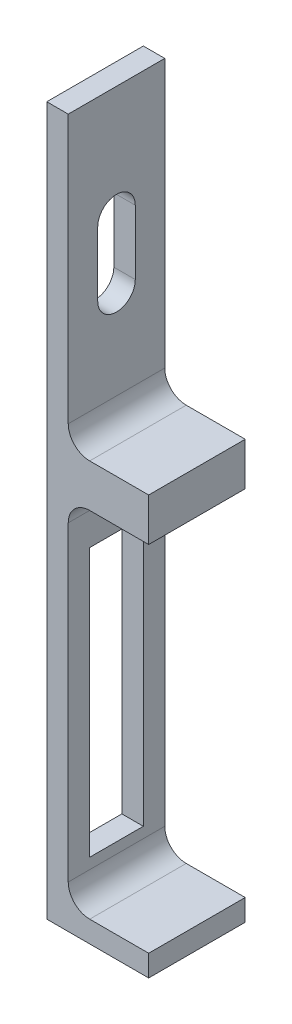
ISO-10303-21;
HEADER;
FILE_DESCRIPTION(('STEP AP214'),'2;1');
FILE_NAME('part.step','',(''),(''),'','','');
FILE_SCHEMA(('AUTOMOTIVE_DESIGN { 1 0 10303 214 1 1 1 1 }'));
ENDSEC;
DATA;
#1=APPLICATION_CONTEXT('core data for automotive mechanical design processes');
#2=APPLICATION_PROTOCOL_DEFINITION('international standard','automotive_design',2000,#1);
#3=PRODUCT_CONTEXT('',#1,'mechanical');
#4=PRODUCT('Part','Part','',(#3));
#5=PRODUCT_RELATED_PRODUCT_CATEGORY('part','',(#4));
#6=PRODUCT_DEFINITION_FORMATION('','',#4);
#7=PRODUCT_DEFINITION_CONTEXT('part definition',#1,'design');
#8=PRODUCT_DEFINITION('design','',#6,#7);
#9=PRODUCT_DEFINITION_SHAPE('','',#8);
#10=(LENGTH_UNIT() NAMED_UNIT(*) SI_UNIT(.MILLI.,.METRE.));
#11=(NAMED_UNIT(*) PLANE_ANGLE_UNIT() SI_UNIT($,.RADIAN.));
#12=(NAMED_UNIT(*) SI_UNIT($,.STERADIAN.) SOLID_ANGLE_UNIT());
#13=UNCERTAINTY_MEASURE_WITH_UNIT(LENGTH_MEASURE(1.E-05),#10,'distance_accuracy_value','');
#14=(GEOMETRIC_REPRESENTATION_CONTEXT(3) GLOBAL_UNCERTAINTY_ASSIGNED_CONTEXT((#13)) GLOBAL_UNIT_ASSIGNED_CONTEXT((#10,
#11,#12)) REPRESENTATION_CONTEXT('',''));
#15=CARTESIAN_POINT('',(0.,0.,0.));
#16=DIRECTION('',(0.,0.,1.));
#17=DIRECTION('',(1.,0.,0.));
#18=AXIS2_PLACEMENT_3D('',#15,#16,#17);
#19=CARTESIAN_POINT('',(2.,2.,9.));
#20=DIRECTION('',(-1.,0.,0.));
#21=DIRECTION('',(0.,0.,1.));
#22=AXIS2_PLACEMENT_3D('',#19,#20,#21);
#23=PLANE('',#22);
#24=DIRECTION('',(0.,1.,0.));
#25=VECTOR('',#24,1.);
#26=CARTESIAN_POINT('',(2.,2.,6.25000000000002));
#27=LINE('',#26,#25);
#28=CARTESIAN_POINT('',(2.,49.52,6.25000000000001));
#29=VERTEX_POINT('',#28);
#30=CARTESIAN_POINT('',(2.,55.52,6.25000000000001));
#31=VERTEX_POINT('',#30);
#32=EDGE_CURVE('E304',#29,#31,#27,.T.);
#33=ORIENTED_EDGE('',*,*,#32,.T.);
#34=CARTESIAN_POINT('',(2.,55.52,4.5));
#35=DIRECTION('',(-1.,0.,0.));
#36=DIRECTION('',(0.,0.,1.));
#37=AXIS2_PLACEMENT_3D('',#34,#35,#36);
#38=CIRCLE('',#37,1.75);
#39=CARTESIAN_POINT('',(2.,55.52,2.75));
#40=VERTEX_POINT('',#39);
#41=EDGE_CURVE('E307',#31,#40,#38,.T.);
#42=ORIENTED_EDGE('',*,*,#41,.T.);
#43=DIRECTION('',(0.,-1.,0.));
#44=VECTOR('',#43,1.);
#45=CARTESIAN_POINT('',(2.,2.,2.75000000000002));
#46=LINE('',#45,#44);
#47=CARTESIAN_POINT('',(2.,49.52,2.75));
#48=VERTEX_POINT('',#47);
#49=EDGE_CURVE('E298',#40,#48,#46,.T.);
#50=ORIENTED_EDGE('',*,*,#49,.T.);
#51=CARTESIAN_POINT('',(2.,49.52,4.50000000000001));
#52=DIRECTION('',(-1.,0.,0.));
#53=DIRECTION('',(0.,0.,1.));
#54=AXIS2_PLACEMENT_3D('',#51,#52,#53);
#55=CIRCLE('',#54,1.75);
#56=EDGE_CURVE('E301',#48,#29,#55,.T.);
#57=ORIENTED_EDGE('',*,*,#56,.T.);
#58=EDGE_LOOP('',(#33,#42,#50,#57));
#59=FACE_BOUND('',#58,.T.);
#60=DIRECTION('',(0.,1.,0.));
#61=VECTOR('',#60,1.);
#62=CARTESIAN_POINT('',(2.,2.,9.));
#63=LINE('',#62,#61);
#64=CARTESIAN_POINT('',(2.,41.,9.));
#65=VERTEX_POINT('',#64);
#66=CARTESIAN_POINT('',(2.,66.,9.));
#67=VERTEX_POINT('',#66);
#68=EDGE_CURVE('E264',#65,#67,#63,.T.);
#69=ORIENTED_EDGE('',*,*,#68,.F.);
#70=DIRECTION('',(0.,0.,1.));
#71=VECTOR('',#70,1.);
#72=CARTESIAN_POINT('',(2.,41.,9.));
#73=LINE('',#72,#71);
#74=CARTESIAN_POINT('',(2.,41.,0.));
#75=VERTEX_POINT('',#74);
#76=EDGE_CURVE('E322',#65,#75,#73,.F.);
#77=ORIENTED_EDGE('',*,*,#76,.T.);
#78=DIRECTION('',(0.,1.,0.));
#79=VECTOR('',#78,1.);
#80=CARTESIAN_POINT('',(2.,2.,0.));
#81=LINE('',#80,#79);
#82=CARTESIAN_POINT('',(2.,66.,0.));
#83=VERTEX_POINT('',#82);
#84=EDGE_CURVE('E279',#75,#83,#81,.T.);
#85=ORIENTED_EDGE('',*,*,#84,.T.);
#86=DIRECTION('',(0.,0.,-1.));
#87=VECTOR('',#86,1.);
#88=CARTESIAN_POINT('',(2.,66.,9.));
#89=LINE('',#88,#87);
#90=EDGE_CURVE('E286',#67,#83,#89,.T.);
#91=ORIENTED_EDGE('',*,*,#90,.F.);
#92=EDGE_LOOP('',(#69,#77,#85,#91));
#93=FACE_BOUND('',#92,.T.);
#94=ADVANCED_FACE('F36',(#59,#93),#23,.F.);
#95=CARTESIAN_POINT('',(0.,66.,9.));
#96=DIRECTION('',(1.,0.,0.));
#97=DIRECTION('',(0.,1.,0.));
#98=AXIS2_PLACEMENT_3D('',#95,#96,#97);
#99=PLANE('',#98);
#100=DIRECTION('',(0.,0.,1.));
#101=VECTOR('',#100,1.);
#102=CARTESIAN_POINT('',(0.,30.,7.));
#103=LINE('',#102,#101);
#104=CARTESIAN_POINT('',(0.,30.,2.00000000000001));
#105=VERTEX_POINT('',#104);
#106=CARTESIAN_POINT('',(0.,30.,7.));
#107=VERTEX_POINT('',#106);
#108=EDGE_CURVE('E210',#105,#107,#103,.T.);
#109=ORIENTED_EDGE('',*,*,#108,.T.);
#110=DIRECTION('',(0.,-1.,0.));
#111=VECTOR('',#110,1.);
#112=CARTESIAN_POINT('',(0.,5.,7.));
#113=LINE('',#112,#111);
#114=CARTESIAN_POINT('',(0.,5.,7.));
#115=VERTEX_POINT('',#114);
#116=EDGE_CURVE('E200',#107,#115,#113,.T.);
#117=ORIENTED_EDGE('',*,*,#116,.T.);
#118=DIRECTION('',(0.,0.,-1.));
#119=VECTOR('',#118,1.);
#120=CARTESIAN_POINT('',(0.,5.,7.));
#121=LINE('',#120,#119);
#122=CARTESIAN_POINT('',(0.,5.,2.00000000000001));
#123=VERTEX_POINT('',#122);
#124=EDGE_CURVE('E203',#115,#123,#121,.T.);
#125=ORIENTED_EDGE('',*,*,#124,.T.);
#126=DIRECTION('',(0.,1.,0.));
#127=VECTOR('',#126,1.);
#128=CARTESIAN_POINT('',(0.,5.,2.00000000000001));
#129=LINE('',#128,#127);
#130=EDGE_CURVE('E207',#123,#105,#129,.T.);
#131=ORIENTED_EDGE('',*,*,#130,.T.);
#132=EDGE_LOOP('',(#109,#117,#125,#131));
#133=FACE_BOUND('',#132,.T.);
#134=DIRECTION('',(0.,-1.,0.));
#135=VECTOR('',#134,1.);
#136=CARTESIAN_POINT('',(0.,55.52,2.75));
#137=LINE('',#136,#135);
#138=CARTESIAN_POINT('',(0.,55.52,2.75));
#139=VERTEX_POINT('',#138);
#140=CARTESIAN_POINT('',(0.,49.52,2.75));
#141=VERTEX_POINT('',#140);
#142=EDGE_CURVE('E235',#139,#141,#137,.T.);
#143=ORIENTED_EDGE('',*,*,#142,.F.);
#144=CARTESIAN_POINT('',(0.,55.52,4.5));
#145=DIRECTION('',(-1.,0.,0.));
#146=DIRECTION('',(0.,-1.,0.));
#147=AXIS2_PLACEMENT_3D('',#144,#145,#146);
#148=CIRCLE('',#147,1.75);
#149=CARTESIAN_POINT('',(0.,55.52,6.25000000000001));
#150=VERTEX_POINT('',#149);
#151=EDGE_CURVE('E227',#150,#139,#148,.T.);
#152=ORIENTED_EDGE('',*,*,#151,.F.);
#153=DIRECTION('',(0.,1.,0.));
#154=VECTOR('',#153,1.);
#155=CARTESIAN_POINT('',(0.,55.52,6.25000000000001));
#156=LINE('',#155,#154);
#157=CARTESIAN_POINT('',(0.,49.52,6.25000000000001));
#158=VERTEX_POINT('',#157);
#159=EDGE_CURVE('E241',#158,#150,#156,.T.);
#160=ORIENTED_EDGE('',*,*,#159,.F.);
#161=CARTESIAN_POINT('',(0.,49.52,4.50000000000001));
#162=DIRECTION('',(-1.,0.,0.));
#163=DIRECTION('',(0.,-1.,0.));
#164=AXIS2_PLACEMENT_3D('',#161,#162,#163);
#165=CIRCLE('',#164,1.75);
#166=EDGE_CURVE('E238',#141,#158,#165,.T.);
#167=ORIENTED_EDGE('',*,*,#166,.F.);
#168=EDGE_LOOP('',(#143,#152,#160,#167));
#169=FACE_BOUND('',#168,.T.);
#170=DIRECTION('',(0.,-1.,0.));
#171=VECTOR('',#170,1.);
#172=CARTESIAN_POINT('',(0.,66.,0.));
#173=LINE('',#172,#171);
#174=CARTESIAN_POINT('',(0.,66.,0.));
#175=VERTEX_POINT('',#174);
#176=CARTESIAN_POINT('',(0.,0.,0.));
#177=VERTEX_POINT('',#176);
#178=EDGE_CURVE('E247',#175,#177,#173,.T.);
#179=ORIENTED_EDGE('',*,*,#178,.T.);
#180=DIRECTION('',(0.,0.,-1.));
#181=VECTOR('',#180,1.);
#182=CARTESIAN_POINT('',(0.,0.,9.));
#183=LINE('',#182,#181);
#184=CARTESIAN_POINT('',(0.,0.,9.));
#185=VERTEX_POINT('',#184);
#186=EDGE_CURVE('E295',#185,#177,#183,.T.);
#187=ORIENTED_EDGE('',*,*,#186,.F.);
#188=DIRECTION('',(0.,-1.,0.));
#189=VECTOR('',#188,1.);
#190=CARTESIAN_POINT('',(0.,66.,9.));
#191=LINE('',#190,#189);
#192=CARTESIAN_POINT('',(0.,66.,9.));
#193=VERTEX_POINT('',#192);
#194=EDGE_CURVE('E254',#193,#185,#191,.T.);
#195=ORIENTED_EDGE('',*,*,#194,.F.);
#196=DIRECTION('',(0.,0.,-1.));
#197=VECTOR('',#196,1.);
#198=CARTESIAN_POINT('',(0.,66.,9.));
#199=LINE('',#198,#197);
#200=EDGE_CURVE('E269',#193,#175,#199,.T.);
#201=ORIENTED_EDGE('',*,*,#200,.T.);
#202=EDGE_LOOP('',(#179,#187,#195,#201));
#203=FACE_BOUND('',#202,.T.);
#204=ADVANCED_FACE('F357',(#133,#169,#203),#99,.F.);
#205=CARTESIAN_POINT('',(0.,0.,9.));
#206=DIRECTION('',(0.,1.,0.));
#207=DIRECTION('',(0.,0.,1.));
#208=AXIS2_PLACEMENT_3D('',#205,#206,#207);
#209=PLANE('',#208);
#210=DIRECTION('',(1.,0.,0.));
#211=VECTOR('',#210,1.);
#212=CARTESIAN_POINT('',(0.,0.,0.));
#213=LINE('',#212,#211);
#214=CARTESIAN_POINT('',(9.5,0.,0.));
#215=VERTEX_POINT('',#214);
#216=EDGE_CURVE('E272',#177,#215,#213,.T.);
#217=ORIENTED_EDGE('',*,*,#216,.T.);
#218=DIRECTION('',(0.,0.,-1.));
#219=VECTOR('',#218,1.);
#220=CARTESIAN_POINT('',(9.5,0.,9.));
#221=LINE('',#220,#219);
#222=CARTESIAN_POINT('',(9.5,0.,9.));
#223=VERTEX_POINT('',#222);
#224=EDGE_CURVE('E292',#223,#215,#221,.T.);
#225=ORIENTED_EDGE('',*,*,#224,.F.);
#226=DIRECTION('',(1.,0.,0.));
#227=VECTOR('',#226,1.);
#228=CARTESIAN_POINT('',(0.,0.,9.));
#229=LINE('',#228,#227);
#230=EDGE_CURVE('E256',#185,#223,#229,.T.);
#231=ORIENTED_EDGE('',*,*,#230,.F.);
#232=ORIENTED_EDGE('',*,*,#186,.T.);
#233=EDGE_LOOP('',(#217,#225,#231,#232));
#234=FACE_BOUND('',#233,.T.);
#235=ADVANCED_FACE('F359',(#234),#209,.F.);
#236=CARTESIAN_POINT('',(9.5,0.,9.));
#237=DIRECTION('',(-1.,0.,0.));
#238=DIRECTION('',(0.,0.,1.));
#239=AXIS2_PLACEMENT_3D('',#236,#237,#238);
#240=PLANE('',#239);
#241=DIRECTION('',(0.,1.,0.));
#242=VECTOR('',#241,1.);
#243=CARTESIAN_POINT('',(9.5,0.,0.));
#244=LINE('',#243,#242);
#245=CARTESIAN_POINT('',(9.5,2.,0.));
#246=VERTEX_POINT('',#245);
#247=EDGE_CURVE('E274',#215,#246,#244,.T.);
#248=ORIENTED_EDGE('',*,*,#247,.T.);
#249=DIRECTION('',(0.,0.,-1.));
#250=VECTOR('',#249,1.);
#251=CARTESIAN_POINT('',(9.5,2.,9.));
#252=LINE('',#251,#250);
#253=CARTESIAN_POINT('',(9.5,2.,9.));
#254=VERTEX_POINT('',#253);
#255=EDGE_CURVE('E289',#254,#246,#252,.T.);
#256=ORIENTED_EDGE('',*,*,#255,.F.);
#257=DIRECTION('',(0.,1.,0.));
#258=VECTOR('',#257,1.);
#259=CARTESIAN_POINT('',(9.5,0.,9.));
#260=LINE('',#259,#258);
#261=EDGE_CURVE('E259',#223,#254,#260,.T.);
#262=ORIENTED_EDGE('',*,*,#261,.F.);
#263=ORIENTED_EDGE('',*,*,#224,.T.);
#264=EDGE_LOOP('',(#248,#256,#262,#263));
#265=FACE_BOUND('',#264,.T.);
#266=ADVANCED_FACE('F364',(#265),#240,.F.);
#267=CARTESIAN_POINT('',(9.5,2.,9.));
#268=DIRECTION('',(0.,-1.,0.));
#269=DIRECTION('',(1.,0.,0.));
#270=AXIS2_PLACEMENT_3D('',#267,#268,#269);
#271=PLANE('',#270);
#272=DIRECTION('',(-1.,0.,0.));
#273=VECTOR('',#272,1.);
#274=CARTESIAN_POINT('',(9.5,2.,0.));
#275=LINE('',#274,#273);
#276=CARTESIAN_POINT('',(4.,2.,0.));
#277=VERTEX_POINT('',#276);
#278=EDGE_CURVE('E276',#246,#277,#275,.T.);
#279=ORIENTED_EDGE('',*,*,#278,.T.);
#280=DIRECTION('',(0.,0.,-1.));
#281=VECTOR('',#280,1.);
#282=CARTESIAN_POINT('',(4.,2.,9.));
#283=LINE('',#282,#281);
#284=CARTESIAN_POINT('',(4.,2.,9.));
#285=VERTEX_POINT('',#284);
#286=EDGE_CURVE('E313',#277,#285,#283,.F.);
#287=ORIENTED_EDGE('',*,*,#286,.T.);
#288=DIRECTION('',(-1.,0.,0.));
#289=VECTOR('',#288,1.);
#290=CARTESIAN_POINT('',(9.5,2.,9.));
#291=LINE('',#290,#289);
#292=EDGE_CURVE('E261',#254,#285,#291,.T.);
#293=ORIENTED_EDGE('',*,*,#292,.F.);
#294=ORIENTED_EDGE('',*,*,#255,.T.);
#295=EDGE_LOOP('',(#279,#287,#293,#294));
#296=FACE_BOUND('',#295,.T.);
#297=ADVANCED_FACE('F395',(#296),#271,.F.);
#298=DIRECTION('',(0.,0.,-1.));
#299=VECTOR('',#298,1.);
#300=CARTESIAN_POINT('',(2.,5.,7.));
#301=LINE('',#300,#299);
#302=CARTESIAN_POINT('',(2.,5.,7.));
#303=VERTEX_POINT('',#302);
#304=CARTESIAN_POINT('',(2.,5.,2.00000000000001));
#305=VERTEX_POINT('',#304);
#306=EDGE_CURVE('E216',#303,#305,#301,.T.);
#307=ORIENTED_EDGE('',*,*,#306,.F.);
#308=DIRECTION('',(0.,-1.,0.));
#309=VECTOR('',#308,1.);
#310=CARTESIAN_POINT('',(2.,5.,7.));
#311=LINE('',#310,#309);
#312=CARTESIAN_POINT('',(2.,30.,7.));
#313=VERTEX_POINT('',#312);
#314=EDGE_CURVE('E214',#313,#303,#311,.T.);
#315=ORIENTED_EDGE('',*,*,#314,.F.);
#316=DIRECTION('',(0.,0.,1.));
#317=VECTOR('',#316,1.);
#318=CARTESIAN_POINT('',(2.,30.,7.));
#319=LINE('',#318,#317);
#320=CARTESIAN_POINT('',(2.,30.,2.00000000000001));
#321=VERTEX_POINT('',#320);
#322=EDGE_CURVE('E204',#321,#313,#319,.T.);
#323=ORIENTED_EDGE('',*,*,#322,.F.);
#324=DIRECTION('',(0.,1.,0.));
#325=VECTOR('',#324,1.);
#326=CARTESIAN_POINT('',(2.,5.,2.00000000000001));
#327=LINE('',#326,#325);
#328=EDGE_CURVE('E220',#305,#321,#327,.T.);
#329=ORIENTED_EDGE('',*,*,#328,.F.);
#330=EDGE_LOOP('',(#307,#315,#323,#329));
#331=FACE_BOUND('',#330,.T.);
#332=CARTESIAN_POINT('',(2.,4.,0.));
#333=VERTEX_POINT('',#332);
#334=CARTESIAN_POINT('',(2.,33.,0.));
#335=VERTEX_POINT('',#334);
#336=EDGE_CURVE('E280',#333,#335,#81,.T.);
#337=ORIENTED_EDGE('',*,*,#336,.T.);
#338=DIRECTION('',(0.,0.,1.));
#339=VECTOR('',#338,1.);
#340=CARTESIAN_POINT('',(2.,33.,9.));
#341=LINE('',#340,#339);
#342=CARTESIAN_POINT('',(2.,33.,9.));
#343=VERTEX_POINT('',#342);
#344=EDGE_CURVE('E324',#335,#343,#341,.T.);
#345=ORIENTED_EDGE('',*,*,#344,.T.);
#346=CARTESIAN_POINT('',(2.,4.,9.));
#347=VERTEX_POINT('',#346);
#348=EDGE_CURVE('E265',#347,#343,#63,.T.);
#349=ORIENTED_EDGE('',*,*,#348,.F.);
#350=DIRECTION('',(0.,0.,-1.));
#351=VECTOR('',#350,1.);
#352=CARTESIAN_POINT('',(2.,4.,0.));
#353=LINE('',#352,#351);
#354=EDGE_CURVE('E310',#347,#333,#353,.T.);
#355=ORIENTED_EDGE('',*,*,#354,.T.);
#356=EDGE_LOOP('',(#337,#345,#349,#355));
#357=FACE_BOUND('',#356,.T.);
#358=ADVANCED_FACE('F375',(#331,#357),#23,.F.);
#359=CARTESIAN_POINT('',(2.,66.,9.));
#360=DIRECTION('',(0.,-1.,0.));
#361=DIRECTION('',(0.,0.,-1.));
#362=AXIS2_PLACEMENT_3D('',#359,#360,#361);
#363=PLANE('',#362);
#364=DIRECTION('',(-1.,0.,0.));
#365=VECTOR('',#364,1.);
#366=CARTESIAN_POINT('',(2.,66.,0.));
#367=LINE('',#366,#365);
#368=EDGE_CURVE('E257',#83,#175,#367,.T.);
#369=ORIENTED_EDGE('',*,*,#368,.T.);
#370=ORIENTED_EDGE('',*,*,#200,.F.);
#371=DIRECTION('',(-1.,0.,0.));
#372=VECTOR('',#371,1.);
#373=CARTESIAN_POINT('',(2.,66.,9.));
#374=LINE('',#373,#372);
#375=EDGE_CURVE('E267',#67,#193,#374,.T.);
#376=ORIENTED_EDGE('',*,*,#375,.F.);
#377=ORIENTED_EDGE('',*,*,#90,.T.);
#378=EDGE_LOOP('',(#369,#370,#376,#377));
#379=FACE_BOUND('',#378,.T.);
#380=ADVANCED_FACE('F352',(#379),#363,.F.);
#381=CARTESIAN_POINT('',(0.,0.,9.));
#382=DIRECTION('',(0.,0.,1.));
#383=DIRECTION('',(1.,0.,0.));
#384=AXIS2_PLACEMENT_3D('',#381,#382,#383);
#385=PLANE('',#384);
#386=ORIENTED_EDGE('',*,*,#194,.T.);
#387=ORIENTED_EDGE('',*,*,#230,.T.);
#388=ORIENTED_EDGE('',*,*,#261,.T.);
#389=ORIENTED_EDGE('',*,*,#292,.T.);
#390=CARTESIAN_POINT('',(4.,4.,9.));
#391=DIRECTION('',(0.,0.,1.));
#392=DIRECTION('',(1.,0.,0.));
#393=AXIS2_PLACEMENT_3D('',#390,#391,#392);
#394=CIRCLE('',#393,2.);
#395=EDGE_CURVE('E317',#285,#347,#394,.F.);
#396=ORIENTED_EDGE('',*,*,#395,.T.);
#397=ORIENTED_EDGE('',*,*,#348,.T.);
#398=CARTESIAN_POINT('',(4.,33.,9.));
#399=DIRECTION('',(0.,0.,1.));
#400=DIRECTION('',(1.,0.,0.));
#401=AXIS2_PLACEMENT_3D('',#398,#399,#400);
#402=CIRCLE('',#401,2.);
#403=CARTESIAN_POINT('',(4.,35.,9.));
#404=VERTEX_POINT('',#403);
#405=EDGE_CURVE('E44',#343,#404,#402,.F.);
#406=ORIENTED_EDGE('',*,*,#405,.T.);
#407=DIRECTION('',(1.,0.,0.));
#408=VECTOR('',#407,1.);
#409=CARTESIAN_POINT('',(2.,35.,9.));
#410=LINE('',#409,#408);
#411=CARTESIAN_POINT('',(9.5,35.,9.));
#412=VERTEX_POINT('',#411);
#413=EDGE_CURVE('E176',#404,#412,#410,.T.);
#414=ORIENTED_EDGE('',*,*,#413,.T.);
#415=DIRECTION('',(0.,1.,0.));
#416=VECTOR('',#415,1.);
#417=CARTESIAN_POINT('',(9.5,39.,9.));
#418=LINE('',#417,#416);
#419=CARTESIAN_POINT('',(9.5,39.,9.));
#420=VERTEX_POINT('',#419);
#421=EDGE_CURVE('E182',#412,#420,#418,.T.);
#422=ORIENTED_EDGE('',*,*,#421,.T.);
#423=DIRECTION('',(-1.,0.,0.));
#424=VECTOR('',#423,1.);
#425=CARTESIAN_POINT('',(2.,39.,9.));
#426=LINE('',#425,#424);
#427=CARTESIAN_POINT('',(4.,39.,9.));
#428=VERTEX_POINT('',#427);
#429=EDGE_CURVE('E183',#420,#428,#426,.T.);
#430=ORIENTED_EDGE('',*,*,#429,.T.);
#431=CARTESIAN_POINT('',(4.,41.,9.));
#432=DIRECTION('',(0.,0.,1.));
#433=DIRECTION('',(1.,0.,0.));
#434=AXIS2_PLACEMENT_3D('',#431,#432,#433);
#435=CIRCLE('',#434,2.);
#436=EDGE_CURVE('E328',#428,#65,#435,.F.);
#437=ORIENTED_EDGE('',*,*,#436,.T.);
#438=ORIENTED_EDGE('',*,*,#68,.T.);
#439=ORIENTED_EDGE('',*,*,#375,.T.);
#440=EDGE_LOOP('',(#386,#387,#388,#389,#396,#397,#406,#414,#422,#430,#437,#438,#439));
#441=FACE_BOUND('',#440,.T.);
#442=ADVANCED_FACE('F179',(#441),#385,.T.);
#443=CARTESIAN_POINT('',(0.,0.,0.));
#444=DIRECTION('',(0.,0.,1.));
#445=DIRECTION('',(1.,0.,0.));
#446=AXIS2_PLACEMENT_3D('',#443,#444,#445);
#447=PLANE('',#446);
#448=ORIENTED_EDGE('',*,*,#178,.F.);
#449=ORIENTED_EDGE('',*,*,#368,.F.);
#450=ORIENTED_EDGE('',*,*,#84,.F.);
#451=CARTESIAN_POINT('',(4.,41.,0.));
#452=DIRECTION('',(0.,0.,1.));
#453=DIRECTION('',(1.,0.,0.));
#454=AXIS2_PLACEMENT_3D('',#451,#452,#453);
#455=CIRCLE('',#454,2.);
#456=CARTESIAN_POINT('',(4.,39.,0.));
#457=VERTEX_POINT('',#456);
#458=EDGE_CURVE('E330',#75,#457,#455,.T.);
#459=ORIENTED_EDGE('',*,*,#458,.T.);
#460=DIRECTION('',(1.,0.,0.));
#461=VECTOR('',#460,1.);
#462=CARTESIAN_POINT('',(2.,39.,0.));
#463=LINE('',#462,#461);
#464=CARTESIAN_POINT('',(9.5,39.,0.));
#465=VERTEX_POINT('',#464);
#466=EDGE_CURVE('E217',#457,#465,#463,.T.);
#467=ORIENTED_EDGE('',*,*,#466,.T.);
#468=DIRECTION('',(0.,-1.,0.));
#469=VECTOR('',#468,1.);
#470=CARTESIAN_POINT('',(9.5,39.,0.));
#471=LINE('',#470,#469);
#472=CARTESIAN_POINT('',(9.5,35.,0.));
#473=VERTEX_POINT('',#472);
#474=EDGE_CURVE('E343',#465,#473,#471,.T.);
#475=ORIENTED_EDGE('',*,*,#474,.T.);
#476=DIRECTION('',(-1.,0.,0.));
#477=VECTOR('',#476,1.);
#478=CARTESIAN_POINT('',(2.,35.,0.));
#479=LINE('',#478,#477);
#480=CARTESIAN_POINT('',(4.,35.,0.));
#481=VERTEX_POINT('',#480);
#482=EDGE_CURVE('E188',#473,#481,#479,.T.);
#483=ORIENTED_EDGE('',*,*,#482,.T.);
#484=CARTESIAN_POINT('',(4.,33.,0.));
#485=DIRECTION('',(0.,0.,1.));
#486=DIRECTION('',(1.,0.,0.));
#487=AXIS2_PLACEMENT_3D('',#484,#485,#486);
#488=CIRCLE('',#487,2.);
#489=EDGE_CURVE('E11',#481,#335,#488,.T.);
#490=ORIENTED_EDGE('',*,*,#489,.T.);
#491=ORIENTED_EDGE('',*,*,#336,.F.);
#492=CARTESIAN_POINT('',(4.,4.,0.));
#493=DIRECTION('',(0.,0.,1.));
#494=DIRECTION('',(1.,0.,0.));
#495=AXIS2_PLACEMENT_3D('',#492,#493,#494);
#496=CIRCLE('',#495,2.);
#497=EDGE_CURVE('E315',#333,#277,#496,.T.);
#498=ORIENTED_EDGE('',*,*,#497,.T.);
#499=ORIENTED_EDGE('',*,*,#278,.F.);
#500=ORIENTED_EDGE('',*,*,#247,.F.);
#501=ORIENTED_EDGE('',*,*,#216,.F.);
#502=EDGE_LOOP('',(#448,#449,#450,#459,#467,#475,#483,#490,#491,#498,#499,#500,#501));
#503=FACE_BOUND('',#502,.T.);
#504=ADVANCED_FACE('F336',(#503),#447,.F.);
#505=CARTESIAN_POINT('',(9.5,55.52,4.5));
#506=DIRECTION('',(-1.,0.,0.));
#507=DIRECTION('',(0.,-1.,0.));
#508=AXIS2_PLACEMENT_3D('',#505,#506,#507);
#509=CYLINDRICAL_SURFACE('',#508,1.75);
#510=DIRECTION('',(-1.,0.,0.));
#511=VECTOR('',#510,1.);
#512=CARTESIAN_POINT('',(9.5,55.52,6.25000000000001));
#513=LINE('',#512,#511);
#514=EDGE_CURVE('E245',#31,#150,#513,.T.);
#515=ORIENTED_EDGE('',*,*,#514,.T.);
#516=ORIENTED_EDGE('',*,*,#151,.T.);
#517=DIRECTION('',(-1.,0.,0.));
#518=VECTOR('',#517,1.);
#519=CARTESIAN_POINT('',(9.5,55.52,2.75));
#520=LINE('',#519,#518);
#521=EDGE_CURVE('E244',#40,#139,#520,.T.);
#522=ORIENTED_EDGE('',*,*,#521,.F.);
#523=ORIENTED_EDGE('',*,*,#41,.F.);
#524=EDGE_LOOP('',(#515,#516,#522,#523));
#525=FACE_BOUND('',#524,.T.);
#526=ADVANCED_FACE('F427',(#525),#509,.F.);
#527=CARTESIAN_POINT('',(9.5,55.52,6.25000000000001));
#528=DIRECTION('',(0.,0.,1.));
#529=DIRECTION('',(0.,-1.,0.));
#530=AXIS2_PLACEMENT_3D('',#527,#528,#529);
#531=PLANE('',#530);
#532=DIRECTION('',(-1.,0.,0.));
#533=VECTOR('',#532,1.);
#534=CARTESIAN_POINT('',(9.5,49.52,6.25000000000001));
#535=LINE('',#534,#533);
#536=EDGE_CURVE('E248',#29,#158,#535,.T.);
#537=ORIENTED_EDGE('',*,*,#536,.T.);
#538=ORIENTED_EDGE('',*,*,#159,.T.);
#539=ORIENTED_EDGE('',*,*,#514,.F.);
#540=ORIENTED_EDGE('',*,*,#32,.F.);
#541=EDGE_LOOP('',(#537,#538,#539,#540));
#542=FACE_BOUND('',#541,.T.);
#543=ADVANCED_FACE('F431',(#542),#531,.F.);
#544=CARTESIAN_POINT('',(9.5,49.52,4.50000000000001));
#545=DIRECTION('',(-1.,0.,0.));
#546=DIRECTION('',(0.,-1.,0.));
#547=AXIS2_PLACEMENT_3D('',#544,#545,#546);
#548=CYLINDRICAL_SURFACE('',#547,1.75);
#549=DIRECTION('',(-1.,0.,0.));
#550=VECTOR('',#549,1.);
#551=CARTESIAN_POINT('',(9.5,49.52,2.75));
#552=LINE('',#551,#550);
#553=EDGE_CURVE('E250',#48,#141,#552,.T.);
#554=ORIENTED_EDGE('',*,*,#553,.T.);
#555=ORIENTED_EDGE('',*,*,#166,.T.);
#556=ORIENTED_EDGE('',*,*,#536,.F.);
#557=ORIENTED_EDGE('',*,*,#56,.F.);
#558=EDGE_LOOP('',(#554,#555,#556,#557));
#559=FACE_BOUND('',#558,.T.);
#560=ADVANCED_FACE('F433',(#559),#548,.F.);
#561=CARTESIAN_POINT('',(9.5,55.52,2.75));
#562=DIRECTION('',(0.,0.,-1.));
#563=DIRECTION('',(0.,1.,0.));
#564=AXIS2_PLACEMENT_3D('',#561,#562,#563);
#565=PLANE('',#564);
#566=ORIENTED_EDGE('',*,*,#521,.T.);
#567=ORIENTED_EDGE('',*,*,#142,.T.);
#568=ORIENTED_EDGE('',*,*,#553,.F.);
#569=ORIENTED_EDGE('',*,*,#49,.F.);
#570=EDGE_LOOP('',(#566,#567,#568,#569));
#571=FACE_BOUND('',#570,.T.);
#572=ADVANCED_FACE('F423',(#571),#565,.F.);
#573=CARTESIAN_POINT('',(0.,5.,7.));
#574=DIRECTION('',(0.,0.,1.));
#575=DIRECTION('',(0.,-1.,0.));
#576=AXIS2_PLACEMENT_3D('',#573,#574,#575);
#577=PLANE('',#576);
#578=ORIENTED_EDGE('',*,*,#314,.T.);
#579=DIRECTION('',(1.,0.,0.));
#580=VECTOR('',#579,1.);
#581=CARTESIAN_POINT('',(0.,5.,7.));
#582=LINE('',#581,#580);
#583=EDGE_CURVE('E213',#115,#303,#582,.T.);
#584=ORIENTED_EDGE('',*,*,#583,.F.);
#585=ORIENTED_EDGE('',*,*,#116,.F.);
#586=DIRECTION('',(1.,0.,0.));
#587=VECTOR('',#586,1.);
#588=CARTESIAN_POINT('',(0.,30.,7.));
#589=LINE('',#588,#587);
#590=EDGE_CURVE('E225',#107,#313,#589,.T.);
#591=ORIENTED_EDGE('',*,*,#590,.T.);
#592=EDGE_LOOP('',(#578,#584,#585,#591));
#593=FACE_BOUND('',#592,.T.);
#594=ADVANCED_FACE('F411',(#593),#577,.F.);
#595=CARTESIAN_POINT('',(0.,30.,7.));
#596=DIRECTION('',(0.,1.,0.));
#597=DIRECTION('',(0.,0.,1.));
#598=AXIS2_PLACEMENT_3D('',#595,#596,#597);
#599=PLANE('',#598);
#600=ORIENTED_EDGE('',*,*,#322,.T.);
#601=ORIENTED_EDGE('',*,*,#590,.F.);
#602=ORIENTED_EDGE('',*,*,#108,.F.);
#603=DIRECTION('',(1.,0.,0.));
#604=VECTOR('',#603,1.);
#605=CARTESIAN_POINT('',(0.,30.,2.00000000000001));
#606=LINE('',#605,#604);
#607=EDGE_CURVE('E228',#105,#321,#606,.T.);
#608=ORIENTED_EDGE('',*,*,#607,.T.);
#609=EDGE_LOOP('',(#600,#601,#602,#608));
#610=FACE_BOUND('',#609,.T.);
#611=ADVANCED_FACE('F414',(#610),#599,.F.);
#612=CARTESIAN_POINT('',(0.,5.,2.00000000000001));
#613=DIRECTION('',(0.,0.,-1.));
#614=DIRECTION('',(0.,1.,0.));
#615=AXIS2_PLACEMENT_3D('',#612,#613,#614);
#616=PLANE('',#615);
#617=ORIENTED_EDGE('',*,*,#328,.T.);
#618=ORIENTED_EDGE('',*,*,#607,.F.);
#619=ORIENTED_EDGE('',*,*,#130,.F.);
#620=DIRECTION('',(1.,0.,0.));
#621=VECTOR('',#620,1.);
#622=CARTESIAN_POINT('',(0.,5.,2.00000000000001));
#623=LINE('',#622,#621);
#624=EDGE_CURVE('E230',#123,#305,#623,.T.);
#625=ORIENTED_EDGE('',*,*,#624,.T.);
#626=EDGE_LOOP('',(#617,#618,#619,#625));
#627=FACE_BOUND('',#626,.T.);
#628=ADVANCED_FACE('F416',(#627),#616,.F.);
#629=CARTESIAN_POINT('',(0.,5.,7.));
#630=DIRECTION('',(0.,-1.,0.));
#631=DIRECTION('',(0.,0.,-1.));
#632=AXIS2_PLACEMENT_3D('',#629,#630,#631);
#633=PLANE('',#632);
#634=ORIENTED_EDGE('',*,*,#306,.T.);
#635=ORIENTED_EDGE('',*,*,#624,.F.);
#636=ORIENTED_EDGE('',*,*,#124,.F.);
#637=ORIENTED_EDGE('',*,*,#583,.T.);
#638=EDGE_LOOP('',(#634,#635,#636,#637));
#639=FACE_BOUND('',#638,.T.);
#640=ADVANCED_FACE('F407',(#639),#633,.F.);
#641=CARTESIAN_POINT('',(4.,4.,9.));
#642=DIRECTION('',(0.,0.,1.));
#643=DIRECTION('',(1.,0.,0.));
#644=AXIS2_PLACEMENT_3D('',#641,#642,#643);
#645=CYLINDRICAL_SURFACE('',#644,2.);
#646=ORIENTED_EDGE('',*,*,#395,.F.);
#647=ORIENTED_EDGE('',*,*,#286,.F.);
#648=ORIENTED_EDGE('',*,*,#497,.F.);
#649=ORIENTED_EDGE('',*,*,#354,.F.);
#650=EDGE_LOOP('',(#646,#647,#648,#649));
#651=FACE_BOUND('',#650,.T.);
#652=ADVANCED_FACE('F372',(#651),#645,.F.);
#653=CARTESIAN_POINT('',(2.,39.,-8.5));
#654=DIRECTION('',(0.,1.,0.));
#655=DIRECTION('',(0.,0.,1.));
#656=AXIS2_PLACEMENT_3D('',#653,#654,#655);
#657=PLANE('',#656);
#658=ORIENTED_EDGE('',*,*,#466,.F.);
#659=DIRECTION('',(0.,0.,1.));
#660=VECTOR('',#659,1.);
#661=CARTESIAN_POINT('',(4.,39.,-8.5));
#662=LINE('',#661,#660);
#663=EDGE_CURVE('E319',#457,#428,#662,.T.);
#664=ORIENTED_EDGE('',*,*,#663,.T.);
#665=ORIENTED_EDGE('',*,*,#429,.F.);
#666=DIRECTION('',(0.,0.,1.));
#667=VECTOR('',#666,1.);
#668=CARTESIAN_POINT('',(9.5,39.,-8.5));
#669=LINE('',#668,#667);
#670=EDGE_CURVE('E191',#465,#420,#669,.T.);
#671=ORIENTED_EDGE('',*,*,#670,.F.);
#672=EDGE_LOOP('',(#658,#664,#665,#671));
#673=FACE_BOUND('',#672,.T.);
#674=ADVANCED_FACE('F342',(#673),#657,.T.);
#675=CARTESIAN_POINT('',(9.5,39.,-8.5));
#676=DIRECTION('',(1.,0.,0.));
#677=DIRECTION('',(0.,0.,-1.));
#678=AXIS2_PLACEMENT_3D('',#675,#676,#677);
#679=PLANE('',#678);
#680=ORIENTED_EDGE('',*,*,#474,.F.);
#681=ORIENTED_EDGE('',*,*,#670,.T.);
#682=ORIENTED_EDGE('',*,*,#421,.F.);
#683=DIRECTION('',(0.,0.,1.));
#684=VECTOR('',#683,1.);
#685=CARTESIAN_POINT('',(9.5,35.,-8.5));
#686=LINE('',#685,#684);
#687=EDGE_CURVE('E186',#473,#412,#686,.T.);
#688=ORIENTED_EDGE('',*,*,#687,.F.);
#689=EDGE_LOOP('',(#680,#681,#682,#688));
#690=FACE_BOUND('',#689,.T.);
#691=ADVANCED_FACE('F193',(#690),#679,.T.);
#692=CARTESIAN_POINT('',(2.,35.,-8.5));
#693=DIRECTION('',(0.,-1.,0.));
#694=DIRECTION('',(0.,0.,-1.));
#695=AXIS2_PLACEMENT_3D('',#692,#693,#694);
#696=PLANE('',#695);
#697=ORIENTED_EDGE('',*,*,#413,.F.);
#698=DIRECTION('',(0.,0.,1.));
#699=VECTOR('',#698,1.);
#700=CARTESIAN_POINT('',(4.,35.,-8.5));
#701=LINE('',#700,#699);
#702=EDGE_CURVE('E57',#404,#481,#701,.F.);
#703=ORIENTED_EDGE('',*,*,#702,.T.);
#704=ORIENTED_EDGE('',*,*,#482,.F.);
#705=ORIENTED_EDGE('',*,*,#687,.T.);
#706=EDGE_LOOP('',(#697,#703,#704,#705));
#707=FACE_BOUND('',#706,.T.);
#708=ADVANCED_FACE('F187',(#707),#696,.T.);
#709=CARTESIAN_POINT('',(4.,41.,-8.5));
#710=DIRECTION('',(0.,0.,1.));
#711=DIRECTION('',(1.,0.,0.));
#712=AXIS2_PLACEMENT_3D('',#709,#710,#711);
#713=CYLINDRICAL_SURFACE('',#712,2.);
#714=ORIENTED_EDGE('',*,*,#458,.F.);
#715=ORIENTED_EDGE('',*,*,#76,.F.);
#716=ORIENTED_EDGE('',*,*,#436,.F.);
#717=ORIENTED_EDGE('',*,*,#663,.F.);
#718=EDGE_LOOP('',(#714,#715,#716,#717));
#719=FACE_BOUND('',#718,.T.);
#720=ADVANCED_FACE('F345',(#719),#713,.F.);
#721=CARTESIAN_POINT('',(4.,33.,9.));
#722=DIRECTION('',(0.,0.,1.));
#723=DIRECTION('',(1.,0.,0.));
#724=AXIS2_PLACEMENT_3D('',#721,#722,#723);
#725=CYLINDRICAL_SURFACE('',#724,2.);
#726=ORIENTED_EDGE('',*,*,#489,.F.);
#727=ORIENTED_EDGE('',*,*,#702,.F.);
#728=ORIENTED_EDGE('',*,*,#405,.F.);
#729=ORIENTED_EDGE('',*,*,#344,.F.);
#730=EDGE_LOOP('',(#726,#727,#728,#729));
#731=FACE_BOUND('',#730,.T.);
#732=ADVANCED_FACE('F38',(#731),#725,.F.);
#733=CLOSED_SHELL('',(#94,#204,#235,#266,#297,#358,#380,#442,#504,#526,#543,#560,#572,#594,#611,
#628,#640,#652,#674,#691,#708,#720,#732));
#734=MANIFOLD_SOLID_BREP('B2',#733);
#735=ADVANCED_BREP_SHAPE_REPRESENTATION('',(#18,#734),#14);
#736=SHAPE_DEFINITION_REPRESENTATION(#9,#735);
ENDSEC;
END-ISO-10303-21;
